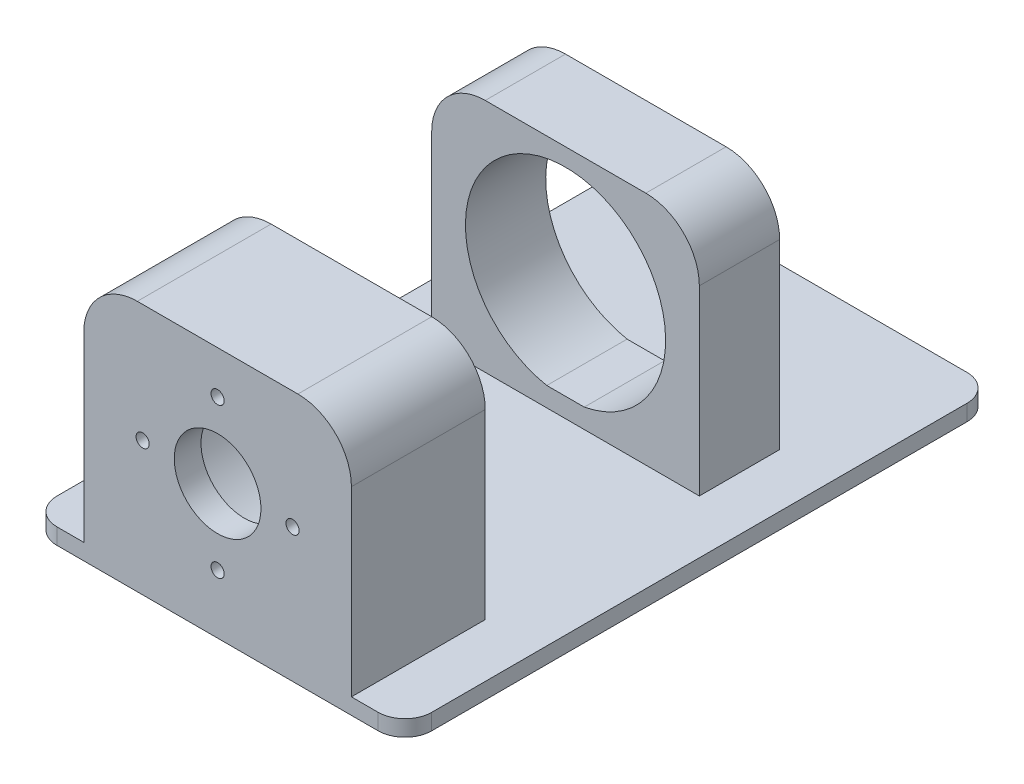
ISO-10303-21;
HEADER;
FILE_DESCRIPTION(('STEP AP214'),'2;1');
FILE_NAME('part.step','',(''),(''),'','','');
FILE_SCHEMA(('AUTOMOTIVE_DESIGN { 1 0 10303 214 1 1 1 1 }'));
ENDSEC;
DATA;
#1=APPLICATION_CONTEXT('core data for automotive mechanical design processes');
#2=APPLICATION_PROTOCOL_DEFINITION('international standard','automotive_design',2000,#1);
#3=PRODUCT_CONTEXT('',#1,'mechanical');
#4=PRODUCT('Part','Part','',(#3));
#5=PRODUCT_RELATED_PRODUCT_CATEGORY('part','',(#4));
#6=PRODUCT_DEFINITION_FORMATION('','',#4);
#7=PRODUCT_DEFINITION_CONTEXT('part definition',#1,'design');
#8=PRODUCT_DEFINITION('design','',#6,#7);
#9=PRODUCT_DEFINITION_SHAPE('','',#8);
#10=(LENGTH_UNIT() NAMED_UNIT(*) SI_UNIT(.MILLI.,.METRE.));
#11=(NAMED_UNIT(*) PLANE_ANGLE_UNIT() SI_UNIT($,.RADIAN.));
#12=(NAMED_UNIT(*) SI_UNIT($,.STERADIAN.) SOLID_ANGLE_UNIT());
#13=UNCERTAINTY_MEASURE_WITH_UNIT(LENGTH_MEASURE(1.E-05),#10,'distance_accuracy_value','');
#14=(GEOMETRIC_REPRESENTATION_CONTEXT(3) GLOBAL_UNCERTAINTY_ASSIGNED_CONTEXT((#13)) GLOBAL_UNIT_ASSIGNED_CONTEXT((#10,
#11,#12)) REPRESENTATION_CONTEXT('',''));
#15=CARTESIAN_POINT('',(0.,0.,0.));
#16=DIRECTION('',(0.,0.,1.));
#17=DIRECTION('',(1.,0.,0.));
#18=AXIS2_PLACEMENT_3D('',#15,#16,#17);
#19=CARTESIAN_POINT('',(0.,-13.0223826502722,0.));
#20=DIRECTION('',(0.,-1.,0.));
#21=DIRECTION('',(0.,0.,-1.));
#22=AXIS2_PLACEMENT_3D('',#19,#20,#21);
#23=PLANE('',#22);
#24=DIRECTION('',(1.,0.,0.));
#25=VECTOR('',#24,1.);
#26=CARTESIAN_POINT('',(23.8257170902648,-13.0223826502722,-59.3149987648499));
#27=LINE('',#26,#25);
#28=CARTESIAN_POINT('',(-41.1742829097352,-13.0223826502722,-59.3149987648499));
#29=VERTEX_POINT('',#28);
#30=CARTESIAN_POINT('',(18.8257170902648,-13.0223826502722,-59.3149987648499));
#31=VERTEX_POINT('',#30);
#32=EDGE_CURVE('E244',#29,#31,#27,.T.);
#33=ORIENTED_EDGE('',*,*,#32,.F.);
#34=CARTESIAN_POINT('',(-41.1742829097352,-13.0223826502722,-54.3149987648499));
#35=DIRECTION('',(0.,-1.,0.));
#36=DIRECTION('',(0.,0.,-1.));
#37=AXIS2_PLACEMENT_3D('',#34,#35,#36);
#38=CIRCLE('',#37,5.);
#39=CARTESIAN_POINT('',(-46.1742829097352,-13.0223826502722,-54.3149987648499));
#40=VERTEX_POINT('',#39);
#41=EDGE_CURVE('E369',#29,#40,#38,.F.);
#42=ORIENTED_EDGE('',*,*,#41,.T.);
#43=DIRECTION('',(0.,0.,-1.));
#44=VECTOR('',#43,1.);
#45=CARTESIAN_POINT('',(-46.1742829097352,-13.0223826502722,-59.3149987648499));
#46=LINE('',#45,#44);
#47=CARTESIAN_POINT('',(-46.1742829097352,-13.0223826502722,45.6850012351502));
#48=VERTEX_POINT('',#47);
#49=EDGE_CURVE('E258',#48,#40,#46,.T.);
#50=ORIENTED_EDGE('',*,*,#49,.F.);
#51=CARTESIAN_POINT('',(-41.1742829097352,-13.0223826502722,45.6850012351502));
#52=DIRECTION('',(0.,-1.,0.));
#53=DIRECTION('',(0.,0.,-1.));
#54=AXIS2_PLACEMENT_3D('',#51,#52,#53);
#55=CIRCLE('',#54,5.);
#56=CARTESIAN_POINT('',(-41.1742829097352,-13.0223826502722,50.6850012351501));
#57=VERTEX_POINT('',#56);
#58=EDGE_CURVE('E363',#48,#57,#55,.F.);
#59=ORIENTED_EDGE('',*,*,#58,.T.);
#60=DIRECTION('',(-1.,0.,0.));
#61=VECTOR('',#60,1.);
#62=CARTESIAN_POINT('',(23.8257170902648,-13.0223826502722,50.6850012351501));
#63=LINE('',#62,#61);
#64=CARTESIAN_POINT('',(-36.1742829097352,-13.0223826502722,50.6850012351501));
#65=VERTEX_POINT('',#64);
#66=EDGE_CURVE('E255',#65,#57,#63,.T.);
#67=ORIENTED_EDGE('',*,*,#66,.F.);
#68=DIRECTION('',(0.,0.,-1.));
#69=VECTOR('',#68,1.);
#70=CARTESIAN_POINT('',(-36.1742829097352,-13.0223826502722,50.6850012351501));
#71=LINE('',#70,#69);
#72=CARTESIAN_POINT('',(-36.1742829097352,-13.0223826502722,25.6850012351502));
#73=VERTEX_POINT('',#72);
#74=EDGE_CURVE('E320',#65,#73,#71,.T.);
#75=ORIENTED_EDGE('',*,*,#74,.T.);
#76=DIRECTION('',(-1.,0.,0.));
#77=VECTOR('',#76,1.);
#78=CARTESIAN_POINT('',(-36.1742829097352,-13.0223826502722,25.6850012351502));
#79=LINE('',#78,#77);
#80=CARTESIAN_POINT('',(13.8257170902648,-13.0223826502722,25.6850012351502));
#81=VERTEX_POINT('',#80);
#82=EDGE_CURVE('E270',#81,#73,#79,.T.);
#83=ORIENTED_EDGE('',*,*,#82,.F.);
#84=DIRECTION('',(0.,0.,-1.));
#85=VECTOR('',#84,1.);
#86=CARTESIAN_POINT('',(13.8257170902648,-13.0223826502722,50.6850012351501));
#87=LINE('',#86,#85);
#88=CARTESIAN_POINT('',(13.8257170902648,-13.0223826502722,50.6850012351501));
#89=VERTEX_POINT('',#88);
#90=EDGE_CURVE('E317',#89,#81,#87,.T.);
#91=ORIENTED_EDGE('',*,*,#90,.F.);
#92=CARTESIAN_POINT('',(18.8257170902648,-13.0223826502722,50.6850012351501));
#93=VERTEX_POINT('',#92);
#94=EDGE_CURVE('E256',#93,#89,#63,.T.);
#95=ORIENTED_EDGE('',*,*,#94,.F.);
#96=CARTESIAN_POINT('',(18.8257170902648,-13.0223826502722,45.6850012351502));
#97=DIRECTION('',(0.,-1.,0.));
#98=DIRECTION('',(0.,0.,-1.));
#99=AXIS2_PLACEMENT_3D('',#96,#97,#98);
#100=CIRCLE('',#99,5.);
#101=CARTESIAN_POINT('',(23.8257170902648,-13.0223826502722,45.6850012351502));
#102=VERTEX_POINT('',#101);
#103=EDGE_CURVE('E365',#93,#102,#100,.F.);
#104=ORIENTED_EDGE('',*,*,#103,.T.);
#105=DIRECTION('',(0.,0.,1.));
#106=VECTOR('',#105,1.);
#107=CARTESIAN_POINT('',(23.8257170902648,-13.0223826502722,-59.3149987648499));
#108=LINE('',#107,#106);
#109=CARTESIAN_POINT('',(23.8257170902648,-13.0223826502722,-54.3149987648499));
#110=VERTEX_POINT('',#109);
#111=EDGE_CURVE('E240',#110,#102,#108,.T.);
#112=ORIENTED_EDGE('',*,*,#111,.F.);
#113=CARTESIAN_POINT('',(18.8257170902648,-13.0223826502722,-54.3149987648499));
#114=DIRECTION('',(0.,-1.,0.));
#115=DIRECTION('',(0.,0.,-1.));
#116=AXIS2_PLACEMENT_3D('',#113,#114,#115);
#117=CIRCLE('',#116,5.);
#118=EDGE_CURVE('E367',#110,#31,#117,.F.);
#119=ORIENTED_EDGE('',*,*,#118,.T.);
#120=EDGE_LOOP('',(#33,#42,#50,#59,#67,#75,#83,#91,#95,#104,#112,#119));
#121=FACE_BOUND('',#120,.T.);
#122=DIRECTION('',(0.,0.,1.));
#123=VECTOR('',#122,1.);
#124=CARTESIAN_POINT('',(13.8257170902648,-13.0223826502722,-29.3149987648499));
#125=LINE('',#124,#123);
#126=CARTESIAN_POINT('',(13.8257170902648,-13.0223826502722,-29.3149987648499));
#127=VERTEX_POINT('',#126);
#128=CARTESIAN_POINT('',(13.8257170902648,-13.0223826502722,-14.3149987648498));
#129=VERTEX_POINT('',#128);
#130=EDGE_CURVE('E237',#127,#129,#125,.T.);
#131=ORIENTED_EDGE('',*,*,#130,.T.);
#132=DIRECTION('',(-1.,0.,0.));
#133=VECTOR('',#132,1.);
#134=CARTESIAN_POINT('',(13.8257170902648,-13.0223826502722,-14.3149987648498));
#135=LINE('',#134,#133);
#136=CARTESIAN_POINT('',(-36.1742829097352,-13.0223826502722,-14.3149987648498));
#137=VERTEX_POINT('',#136);
#138=EDGE_CURVE('E228',#129,#137,#135,.T.);
#139=ORIENTED_EDGE('',*,*,#138,.T.);
#140=DIRECTION('',(0.,0.,1.));
#141=VECTOR('',#140,1.);
#142=CARTESIAN_POINT('',(-36.1742829097352,-13.0223826502722,-29.3149987648499));
#143=LINE('',#142,#141);
#144=CARTESIAN_POINT('',(-36.1742829097352,-13.0223826502722,-29.3149987648499));
#145=VERTEX_POINT('',#144);
#146=EDGE_CURVE('E226',#145,#137,#143,.T.);
#147=ORIENTED_EDGE('',*,*,#146,.F.);
#148=DIRECTION('',(-1.,0.,0.));
#149=VECTOR('',#148,1.);
#150=CARTESIAN_POINT('',(13.8257170902648,-13.0223826502722,-29.3149987648499));
#151=LINE('',#150,#149);
#152=EDGE_CURVE('E216',#127,#145,#151,.T.);
#153=ORIENTED_EDGE('',*,*,#152,.F.);
#154=EDGE_LOOP('',(#131,#139,#147,#153));
#155=FACE_BOUND('',#154,.T.);
#156=ADVANCED_FACE('F39',(#121,#155),#23,.F.);
#157=CARTESIAN_POINT('',(0.,0.,45.6850012351502));
#158=DIRECTION('',(0.,0.,1.));
#159=DIRECTION('',(1.,0.,0.));
#160=AXIS2_PLACEMENT_3D('',#157,#158,#159);
#161=PLANE('',#160);
#162=CARTESIAN_POINT('',(-11.1742829097352,8.9776173497278,45.6850012351502));
#163=DIRECTION('',(0.,0.,1.));
#164=DIRECTION('',(1.,0.,0.));
#165=AXIS2_PLACEMENT_3D('',#162,#163,#164);
#166=CIRCLE('',#165,8.1);
#167=CARTESIAN_POINT('',(-3.07428290973521,8.9776173497278,45.6850012351502));
#168=VERTEX_POINT('',#167);
#169=EDGE_CURVE('E279',#168,#168,#166,.T.);
#170=ORIENTED_EDGE('',*,*,#169,.T.);
#171=EDGE_LOOP('',(#170));
#172=FACE_BOUND('',#171,.T.);
#173=CARTESIAN_POINT('',(-25.1742829097352,8.9776173497278,45.6850012351502));
#174=DIRECTION('',(0.,0.,1.));
#175=DIRECTION('',(1.,0.,0.));
#176=AXIS2_PLACEMENT_3D('',#173,#174,#175);
#177=CIRCLE('',#176,1.2295);
#178=CARTESIAN_POINT('',(-23.9447829097352,8.9776173497278,45.6850012351502));
#179=VERTEX_POINT('',#178);
#180=EDGE_CURVE('E283',#179,#179,#177,.T.);
#181=ORIENTED_EDGE('',*,*,#180,.T.);
#182=EDGE_LOOP('',(#181));
#183=FACE_BOUND('',#182,.T.);
#184=CARTESIAN_POINT('',(-11.1742829097352,-5.0223826502722,45.6850012351502));
#185=DIRECTION('',(0.,0.,1.));
#186=DIRECTION('',(1.,0.,0.));
#187=AXIS2_PLACEMENT_3D('',#184,#185,#186);
#188=CIRCLE('',#187,1.2295);
#189=CARTESIAN_POINT('',(-9.94478290973522,-5.0223826502722,45.6850012351502));
#190=VERTEX_POINT('',#189);
#191=EDGE_CURVE('E289',#190,#190,#188,.T.);
#192=ORIENTED_EDGE('',*,*,#191,.T.);
#193=EDGE_LOOP('',(#192));
#194=FACE_BOUND('',#193,.T.);
#195=CARTESIAN_POINT('',(2.82571709026479,8.9776173497278,45.6850012351502));
#196=DIRECTION('',(0.,0.,1.));
#197=DIRECTION('',(1.,0.,0.));
#198=AXIS2_PLACEMENT_3D('',#195,#196,#197);
#199=CIRCLE('',#198,1.2295);
#200=CARTESIAN_POINT('',(4.05521709026479,8.9776173497278,45.6850012351502));
#201=VERTEX_POINT('',#200);
#202=EDGE_CURVE('E295',#201,#201,#199,.T.);
#203=ORIENTED_EDGE('',*,*,#202,.T.);
#204=EDGE_LOOP('',(#203));
#205=FACE_BOUND('',#204,.T.);
#206=CARTESIAN_POINT('',(-11.1742829097352,22.9776173497278,45.6850012351502));
#207=DIRECTION('',(0.,0.,1.));
#208=DIRECTION('',(1.,0.,0.));
#209=AXIS2_PLACEMENT_3D('',#206,#207,#208);
#210=CIRCLE('',#209,1.2295);
#211=CARTESIAN_POINT('',(-9.94478290973521,22.9776173497278,45.6850012351502));
#212=VERTEX_POINT('',#211);
#213=EDGE_CURVE('E301',#212,#212,#210,.T.);
#214=ORIENTED_EDGE('',*,*,#213,.T.);
#215=EDGE_LOOP('',(#214));
#216=FACE_BOUND('',#215,.T.);
#217=CARTESIAN_POINT('',(-11.1742829097352,8.9776173497278,45.6850012351502));
#218=DIRECTION('',(0.,0.,-1.));
#219=DIRECTION('',(-1.,0.,0.));
#220=AXIS2_PLACEMENT_3D('',#217,#218,#219);
#221=CIRCLE('',#220,18.);
#222=CARTESIAN_POINT('',(-29.1742829097352,8.9776173497278,45.6850012351502));
#223=VERTEX_POINT('',#222);
#224=EDGE_CURVE('E252',#223,#223,#221,.T.);
#225=ORIENTED_EDGE('',*,*,#224,.T.);
#226=EDGE_LOOP('',(#225));
#227=FACE_BOUND('',#226,.T.);
#228=ADVANCED_FACE('F433',(#172,#183,#194,#205,#216,#227),#161,.F.);
#229=CARTESIAN_POINT('',(0.,0.,50.6850012351501));
#230=DIRECTION('',(0.,0.,1.));
#231=DIRECTION('',(1.,0.,0.));
#232=AXIS2_PLACEMENT_3D('',#229,#230,#231);
#233=PLANE('',#232);
#234=CARTESIAN_POINT('',(-25.1742829097352,8.9776173497278,50.6850012351501));
#235=DIRECTION('',(0.,0.,1.));
#236=DIRECTION('',(1.,0.,0.));
#237=AXIS2_PLACEMENT_3D('',#234,#235,#236);
#238=CIRCLE('',#237,1.2295);
#239=CARTESIAN_POINT('',(-23.9447829097352,8.9776173497278,50.6850012351501));
#240=VERTEX_POINT('',#239);
#241=EDGE_CURVE('E286',#240,#240,#238,.T.);
#242=ORIENTED_EDGE('',*,*,#241,.F.);
#243=EDGE_LOOP('',(#242));
#244=FACE_BOUND('',#243,.T.);
#245=CARTESIAN_POINT('',(2.82571709026479,8.9776173497278,50.6850012351501));
#246=DIRECTION('',(0.,0.,1.));
#247=DIRECTION('',(1.,0.,0.));
#248=AXIS2_PLACEMENT_3D('',#245,#246,#247);
#249=CIRCLE('',#248,1.2295);
#250=CARTESIAN_POINT('',(4.05521709026479,8.9776173497278,50.6850012351501));
#251=VERTEX_POINT('',#250);
#252=EDGE_CURVE('E298',#251,#251,#249,.T.);
#253=ORIENTED_EDGE('',*,*,#252,.F.);
#254=EDGE_LOOP('',(#253));
#255=FACE_BOUND('',#254,.T.);
#256=DIRECTION('',(-1.,0.,0.));
#257=VECTOR('',#256,1.);
#258=CARTESIAN_POINT('',(23.8257170902648,-16.0223826502722,50.6850012351501));
#259=LINE('',#258,#257);
#260=CARTESIAN_POINT('',(18.8257170902648,-16.0223826502722,50.6850012351501));
#261=VERTEX_POINT('',#260);
#262=CARTESIAN_POINT('',(-41.1742829097352,-16.0223826502722,50.6850012351501));
#263=VERTEX_POINT('',#262);
#264=EDGE_CURVE('E243',#261,#263,#259,.T.);
#265=ORIENTED_EDGE('',*,*,#264,.F.);
#266=DIRECTION('',(0.,1.,0.));
#267=VECTOR('',#266,1.);
#268=CARTESIAN_POINT('',(18.8257170902648,-13.0223826502722,50.6850012351501));
#269=LINE('',#268,#267);
#270=EDGE_CURVE('E11',#261,#93,#269,.T.);
#271=ORIENTED_EDGE('',*,*,#270,.T.);
#272=ORIENTED_EDGE('',*,*,#94,.T.);
#273=DIRECTION('',(0.,1.,0.));
#274=VECTOR('',#273,1.);
#275=CARTESIAN_POINT('',(13.8257170902648,30.9776173497278,50.6850012351501));
#276=LINE('',#275,#274);
#277=CARTESIAN_POINT('',(13.8257170902648,20.9776173497278,50.6850012351501));
#278=VERTEX_POINT('',#277);
#279=EDGE_CURVE('E307',#89,#278,#276,.T.);
#280=ORIENTED_EDGE('',*,*,#279,.T.);
#281=CARTESIAN_POINT('',(3.82571709026479,20.9776173497278,50.6850012351501));
#282=DIRECTION('',(0.,0.,1.));
#283=DIRECTION('',(1.,0.,0.));
#284=AXIS2_PLACEMENT_3D('',#281,#282,#283);
#285=CIRCLE('',#284,10.);
#286=CARTESIAN_POINT('',(3.82571709026479,30.9776173497278,50.6850012351501));
#287=VERTEX_POINT('',#286);
#288=EDGE_CURVE('E351',#278,#287,#285,.T.);
#289=ORIENTED_EDGE('',*,*,#288,.T.);
#290=DIRECTION('',(-1.,0.,0.));
#291=VECTOR('',#290,1.);
#292=CARTESIAN_POINT('',(-36.1742829097352,30.9776173497278,50.6850012351501));
#293=LINE('',#292,#291);
#294=CARTESIAN_POINT('',(-26.1742829097352,30.9776173497278,50.6850012351501));
#295=VERTEX_POINT('',#294);
#296=EDGE_CURVE('E312',#287,#295,#293,.T.);
#297=ORIENTED_EDGE('',*,*,#296,.T.);
#298=CARTESIAN_POINT('',(-26.1742829097352,20.9776173497278,50.6850012351501));
#299=DIRECTION('',(0.,0.,1.));
#300=DIRECTION('',(1.,0.,0.));
#301=AXIS2_PLACEMENT_3D('',#298,#299,#300);
#302=CIRCLE('',#301,10.);
#303=CARTESIAN_POINT('',(-36.1742829097352,20.9776173497278,50.6850012351501));
#304=VERTEX_POINT('',#303);
#305=EDGE_CURVE('E349',#295,#304,#302,.T.);
#306=ORIENTED_EDGE('',*,*,#305,.T.);
#307=DIRECTION('',(0.,-1.,0.));
#308=VECTOR('',#307,1.);
#309=CARTESIAN_POINT('',(-36.1742829097352,30.9776173497278,50.6850012351501));
#310=LINE('',#309,#308);
#311=EDGE_CURVE('E315',#304,#65,#310,.T.);
#312=ORIENTED_EDGE('',*,*,#311,.T.);
#313=ORIENTED_EDGE('',*,*,#66,.T.);
#314=DIRECTION('',(0.,1.,0.));
#315=VECTOR('',#314,1.);
#316=CARTESIAN_POINT('',(-41.1742829097352,-16.0223826502722,50.6850012351501));
#317=LINE('',#316,#315);
#318=EDGE_CURVE('E47',#57,#263,#317,.F.);
#319=ORIENTED_EDGE('',*,*,#318,.T.);
#320=EDGE_LOOP('',(#265,#271,#272,#280,#289,#297,#306,#312,#313,#319));
#321=FACE_BOUND('',#320,.T.);
#322=CARTESIAN_POINT('',(-11.1742829097352,22.9776173497278,50.6850012351501));
#323=DIRECTION('',(0.,0.,1.));
#324=DIRECTION('',(1.,0.,0.));
#325=AXIS2_PLACEMENT_3D('',#322,#323,#324);
#326=CIRCLE('',#325,1.2295);
#327=CARTESIAN_POINT('',(-9.94478290973521,22.9776173497278,50.6850012351501));
#328=VERTEX_POINT('',#327);
#329=EDGE_CURVE('E304',#328,#328,#326,.T.);
#330=ORIENTED_EDGE('',*,*,#329,.F.);
#331=EDGE_LOOP('',(#330));
#332=FACE_BOUND('',#331,.T.);
#333=CARTESIAN_POINT('',(-11.1742829097352,-5.0223826502722,50.6850012351501));
#334=DIRECTION('',(0.,0.,1.));
#335=DIRECTION('',(1.,0.,0.));
#336=AXIS2_PLACEMENT_3D('',#333,#334,#335);
#337=CIRCLE('',#336,1.2295);
#338=CARTESIAN_POINT('',(-9.94478290973522,-5.0223826502722,50.6850012351501));
#339=VERTEX_POINT('',#338);
#340=EDGE_CURVE('E292',#339,#339,#337,.T.);
#341=ORIENTED_EDGE('',*,*,#340,.F.);
#342=EDGE_LOOP('',(#341));
#343=FACE_BOUND('',#342,.T.);
#344=CARTESIAN_POINT('',(-11.1742829097352,8.9776173497278,50.6850012351501));
#345=DIRECTION('',(0.,0.,1.));
#346=DIRECTION('',(1.,0.,0.));
#347=AXIS2_PLACEMENT_3D('',#344,#345,#346);
#348=CIRCLE('',#347,8.1);
#349=CARTESIAN_POINT('',(-3.07428290973521,8.9776173497278,50.6850012351501));
#350=VERTEX_POINT('',#349);
#351=EDGE_CURVE('E280',#350,#350,#348,.T.);
#352=ORIENTED_EDGE('',*,*,#351,.F.);
#353=EDGE_LOOP('',(#352));
#354=FACE_BOUND('',#353,.T.);
#355=ADVANCED_FACE('F403',(#244,#255,#321,#332,#343,#354),#233,.T.);
#356=CARTESIAN_POINT('',(13.8257170902648,30.9776173497278,50.6850012351501));
#357=DIRECTION('',(-1.,0.,0.));
#358=DIRECTION('',(0.,-1.,0.));
#359=AXIS2_PLACEMENT_3D('',#356,#357,#358);
#360=PLANE('',#359);
#361=DIRECTION('',(0.,-1.,0.));
#362=VECTOR('',#361,1.);
#363=CARTESIAN_POINT('',(13.8257170902648,-13.0223826502722,25.6850012351502));
#364=LINE('',#363,#362);
#365=CARTESIAN_POINT('',(13.8257170902648,20.9776173497278,25.6850012351502));
#366=VERTEX_POINT('',#365);
#367=EDGE_CURVE('E266',#366,#81,#364,.T.);
#368=ORIENTED_EDGE('',*,*,#367,.F.);
#369=DIRECTION('',(0.,0.,-1.));
#370=VECTOR('',#369,1.);
#371=CARTESIAN_POINT('',(13.8257170902648,20.9776173497278,50.6850012351501));
#372=LINE('',#371,#370);
#373=EDGE_CURVE('E347',#366,#278,#372,.F.);
#374=ORIENTED_EDGE('',*,*,#373,.T.);
#375=ORIENTED_EDGE('',*,*,#279,.F.);
#376=ORIENTED_EDGE('',*,*,#90,.T.);
#377=EDGE_LOOP('',(#368,#374,#375,#376));
#378=FACE_BOUND('',#377,.T.);
#379=ADVANCED_FACE('F479',(#378),#360,.F.);
#380=CARTESIAN_POINT('',(-36.1742829097352,30.9776173497278,50.6850012351501));
#381=DIRECTION('',(0.,-1.,0.));
#382=DIRECTION('',(0.,0.,-1.));
#383=AXIS2_PLACEMENT_3D('',#380,#381,#382);
#384=PLANE('',#383);
#385=ORIENTED_EDGE('',*,*,#296,.F.);
#386=DIRECTION('',(0.,0.,-1.));
#387=VECTOR('',#386,1.);
#388=CARTESIAN_POINT('',(3.82571709026479,30.9776173497278,50.6850012351501));
#389=LINE('',#388,#387);
#390=CARTESIAN_POINT('',(3.82571709026479,30.9776173497278,25.6850012351502));
#391=VERTEX_POINT('',#390);
#392=EDGE_CURVE('E340',#287,#391,#389,.T.);
#393=ORIENTED_EDGE('',*,*,#392,.T.);
#394=DIRECTION('',(1.,0.,0.));
#395=VECTOR('',#394,1.);
#396=CARTESIAN_POINT('',(13.8257170902648,30.9776173497278,25.6850012351502));
#397=LINE('',#396,#395);
#398=CARTESIAN_POINT('',(-26.1742829097352,30.9776173497278,25.6850012351502));
#399=VERTEX_POINT('',#398);
#400=EDGE_CURVE('E276',#399,#391,#397,.T.);
#401=ORIENTED_EDGE('',*,*,#400,.F.);
#402=DIRECTION('',(0.,0.,-1.));
#403=VECTOR('',#402,1.);
#404=CARTESIAN_POINT('',(-26.1742829097352,30.9776173497278,50.6850012351501));
#405=LINE('',#404,#403);
#406=EDGE_CURVE('E338',#399,#295,#405,.F.);
#407=ORIENTED_EDGE('',*,*,#406,.T.);
#408=EDGE_LOOP('',(#385,#393,#401,#407));
#409=FACE_BOUND('',#408,.T.);
#410=ADVANCED_FACE('F484',(#409),#384,.F.);
#411=CARTESIAN_POINT('',(-36.1742829097352,30.9776173497278,50.6850012351501));
#412=DIRECTION('',(1.,0.,0.));
#413=DIRECTION('',(0.,0.,-1.));
#414=AXIS2_PLACEMENT_3D('',#411,#412,#413);
#415=PLANE('',#414);
#416=ORIENTED_EDGE('',*,*,#311,.F.);
#417=DIRECTION('',(0.,0.,-1.));
#418=VECTOR('',#417,1.);
#419=CARTESIAN_POINT('',(-36.1742829097352,20.9776173497278,50.6850012351501));
#420=LINE('',#419,#418);
#421=CARTESIAN_POINT('',(-36.1742829097352,20.9776173497278,25.6850012351502));
#422=VERTEX_POINT('',#421);
#423=EDGE_CURVE('E353',#304,#422,#420,.T.);
#424=ORIENTED_EDGE('',*,*,#423,.T.);
#425=DIRECTION('',(0.,1.,0.));
#426=VECTOR('',#425,1.);
#427=CARTESIAN_POINT('',(-36.1742829097352,30.9776173497278,25.6850012351502));
#428=LINE('',#427,#426);
#429=EDGE_CURVE('E273',#73,#422,#428,.T.);
#430=ORIENTED_EDGE('',*,*,#429,.F.);
#431=ORIENTED_EDGE('',*,*,#74,.F.);
#432=EDGE_LOOP('',(#416,#424,#430,#431));
#433=FACE_BOUND('',#432,.T.);
#434=ADVANCED_FACE('F476',(#433),#415,.F.);
#435=CARTESIAN_POINT('',(-11.1742829097352,22.9776173497278,50.6850012351501));
#436=DIRECTION('',(0.,0.,-1.));
#437=DIRECTION('',(-1.,0.,0.));
#438=AXIS2_PLACEMENT_3D('',#435,#436,#437);
#439=CYLINDRICAL_SURFACE('',#438,1.2295);
#440=ORIENTED_EDGE('',*,*,#329,.T.);
#441=EDGE_LOOP('',(#440));
#442=FACE_BOUND('',#441,.T.);
#443=ORIENTED_EDGE('',*,*,#213,.F.);
#444=EDGE_LOOP('',(#443));
#445=FACE_BOUND('',#444,.T.);
#446=ADVANCED_FACE('F472',(#442,#445),#439,.F.);
#447=CARTESIAN_POINT('',(2.82571709026479,8.9776173497278,50.6850012351501));
#448=DIRECTION('',(0.,0.,-1.));
#449=DIRECTION('',(-1.,0.,0.));
#450=AXIS2_PLACEMENT_3D('',#447,#448,#449);
#451=CYLINDRICAL_SURFACE('',#450,1.2295);
#452=ORIENTED_EDGE('',*,*,#252,.T.);
#453=EDGE_LOOP('',(#452));
#454=FACE_BOUND('',#453,.T.);
#455=ORIENTED_EDGE('',*,*,#202,.F.);
#456=EDGE_LOOP('',(#455));
#457=FACE_BOUND('',#456,.T.);
#458=ADVANCED_FACE('F468',(#454,#457),#451,.F.);
#459=CARTESIAN_POINT('',(-11.1742829097352,-5.0223826502722,50.6850012351501));
#460=DIRECTION('',(0.,0.,-1.));
#461=DIRECTION('',(-1.,0.,0.));
#462=AXIS2_PLACEMENT_3D('',#459,#460,#461);
#463=CYLINDRICAL_SURFACE('',#462,1.2295);
#464=ORIENTED_EDGE('',*,*,#340,.T.);
#465=EDGE_LOOP('',(#464));
#466=FACE_BOUND('',#465,.T.);
#467=ORIENTED_EDGE('',*,*,#191,.F.);
#468=EDGE_LOOP('',(#467));
#469=FACE_BOUND('',#468,.T.);
#470=ADVANCED_FACE('F464',(#466,#469),#463,.F.);
#471=CARTESIAN_POINT('',(-25.1742829097352,8.9776173497278,50.6850012351501));
#472=DIRECTION('',(0.,0.,-1.));
#473=DIRECTION('',(-1.,0.,0.));
#474=AXIS2_PLACEMENT_3D('',#471,#472,#473);
#475=CYLINDRICAL_SURFACE('',#474,1.2295);
#476=ORIENTED_EDGE('',*,*,#241,.T.);
#477=EDGE_LOOP('',(#476));
#478=FACE_BOUND('',#477,.T.);
#479=ORIENTED_EDGE('',*,*,#180,.F.);
#480=EDGE_LOOP('',(#479));
#481=FACE_BOUND('',#480,.T.);
#482=ADVANCED_FACE('F460',(#478,#481),#475,.F.);
#483=CARTESIAN_POINT('',(-11.1742829097352,8.9776173497278,50.6850012351501));
#484=DIRECTION('',(0.,0.,-1.));
#485=DIRECTION('',(-1.,0.,0.));
#486=AXIS2_PLACEMENT_3D('',#483,#484,#485);
#487=CYLINDRICAL_SURFACE('',#486,8.1);
#488=ORIENTED_EDGE('',*,*,#351,.T.);
#489=EDGE_LOOP('',(#488));
#490=FACE_BOUND('',#489,.T.);
#491=ORIENTED_EDGE('',*,*,#169,.F.);
#492=EDGE_LOOP('',(#491));
#493=FACE_BOUND('',#492,.T.);
#494=ADVANCED_FACE('F456',(#490,#493),#487,.F.);
#495=CARTESIAN_POINT('',(0.,0.,25.6850012351502));
#496=DIRECTION('',(0.,0.,1.));
#497=DIRECTION('',(1.,0.,0.));
#498=AXIS2_PLACEMENT_3D('',#495,#496,#497);
#499=PLANE('',#498);
#500=ORIENTED_EDGE('',*,*,#400,.T.);
#501=CARTESIAN_POINT('',(3.82571709026479,20.9776173497278,25.6850012351502));
#502=DIRECTION('',(0.,0.,1.));
#503=DIRECTION('',(1.,0.,0.));
#504=AXIS2_PLACEMENT_3D('',#501,#502,#503);
#505=CIRCLE('',#504,10.);
#506=EDGE_CURVE('E345',#391,#366,#505,.F.);
#507=ORIENTED_EDGE('',*,*,#506,.T.);
#508=ORIENTED_EDGE('',*,*,#367,.T.);
#509=ORIENTED_EDGE('',*,*,#82,.T.);
#510=ORIENTED_EDGE('',*,*,#429,.T.);
#511=CARTESIAN_POINT('',(-26.1742829097352,20.9776173497278,25.6850012351502));
#512=DIRECTION('',(0.,0.,1.));
#513=DIRECTION('',(1.,0.,0.));
#514=AXIS2_PLACEMENT_3D('',#511,#512,#513);
#515=CIRCLE('',#514,10.);
#516=EDGE_CURVE('E343',#422,#399,#515,.F.);
#517=ORIENTED_EDGE('',*,*,#516,.T.);
#518=EDGE_LOOP('',(#500,#507,#508,#509,#510,#517));
#519=FACE_BOUND('',#518,.T.);
#520=CARTESIAN_POINT('',(-11.1742829097352,8.9776173497278,25.6850012351502));
#521=DIRECTION('',(0.,0.,-1.));
#522=DIRECTION('',(-1.,0.,0.));
#523=AXIS2_PLACEMENT_3D('',#520,#521,#522);
#524=CIRCLE('',#523,18.);
#525=CARTESIAN_POINT('',(-29.1742829097352,8.9776173497278,25.6850012351502));
#526=VERTEX_POINT('',#525);
#527=EDGE_CURVE('E263',#526,#526,#524,.T.);
#528=ORIENTED_EDGE('',*,*,#527,.F.);
#529=EDGE_LOOP('',(#528));
#530=FACE_BOUND('',#529,.T.);
#531=ADVANCED_FACE('F452',(#519,#530),#499,.F.);
#532=CARTESIAN_POINT('',(-11.1742829097352,8.9776173497278,25.6850012351502));
#533=DIRECTION('',(0.,0.,1.));
#534=DIRECTION('',(1.,0.,0.));
#535=AXIS2_PLACEMENT_3D('',#532,#533,#534);
#536=CYLINDRICAL_SURFACE('',#535,18.);
#537=ORIENTED_EDGE('',*,*,#527,.T.);
#538=EDGE_LOOP('',(#537));
#539=FACE_BOUND('',#538,.T.);
#540=ORIENTED_EDGE('',*,*,#224,.F.);
#541=EDGE_LOOP('',(#540));
#542=FACE_BOUND('',#541,.T.);
#543=ADVANCED_FACE('F449',(#539,#542),#536,.F.);
#544=CARTESIAN_POINT('',(23.8257170902648,-16.0223826502722,-59.3149987648499));
#545=DIRECTION('',(-1.,0.,0.));
#546=DIRECTION('',(0.,0.,1.));
#547=AXIS2_PLACEMENT_3D('',#544,#545,#546);
#548=PLANE('',#547);
#549=DIRECTION('',(0.,0.,1.));
#550=VECTOR('',#549,1.);
#551=CARTESIAN_POINT('',(23.8257170902648,-16.0223826502722,-59.3149987648499));
#552=LINE('',#551,#550);
#553=CARTESIAN_POINT('',(23.8257170902648,-16.0223826502722,-54.3149987648499));
#554=VERTEX_POINT('',#553);
#555=CARTESIAN_POINT('',(23.8257170902648,-16.0223826502722,45.6850012351502));
#556=VERTEX_POINT('',#555);
#557=EDGE_CURVE('E241',#554,#556,#552,.T.);
#558=ORIENTED_EDGE('',*,*,#557,.F.);
#559=DIRECTION('',(0.,1.,0.));
#560=VECTOR('',#559,1.);
#561=CARTESIAN_POINT('',(23.8257170902648,-16.0223826502722,-54.3149987648499));
#562=LINE('',#561,#560);
#563=EDGE_CURVE('E385',#554,#110,#562,.T.);
#564=ORIENTED_EDGE('',*,*,#563,.T.);
#565=ORIENTED_EDGE('',*,*,#111,.T.);
#566=DIRECTION('',(0.,1.,0.));
#567=VECTOR('',#566,1.);
#568=CARTESIAN_POINT('',(23.8257170902648,-16.0223826502722,45.6850012351502));
#569=LINE('',#568,#567);
#570=EDGE_CURVE('E383',#102,#556,#569,.F.);
#571=ORIENTED_EDGE('',*,*,#570,.T.);
#572=EDGE_LOOP('',(#558,#564,#565,#571));
#573=FACE_BOUND('',#572,.T.);
#574=ADVANCED_FACE('F391',(#573),#548,.F.);
#575=CARTESIAN_POINT('',(-46.1742829097352,-16.0223826502722,-59.3149987648499));
#576=DIRECTION('',(1.,0.,0.));
#577=DIRECTION('',(0.,0.,-1.));
#578=AXIS2_PLACEMENT_3D('',#575,#576,#577);
#579=PLANE('',#578);
#580=ORIENTED_EDGE('',*,*,#49,.T.);
#581=DIRECTION('',(0.,1.,0.));
#582=VECTOR('',#581,1.);
#583=CARTESIAN_POINT('',(-46.1742829097352,-16.0223826502722,-54.3149987648499));
#584=LINE('',#583,#582);
#585=CARTESIAN_POINT('',(-46.1742829097352,-16.0223826502722,-54.3149987648499));
#586=VERTEX_POINT('',#585);
#587=EDGE_CURVE('E374',#40,#586,#584,.F.);
#588=ORIENTED_EDGE('',*,*,#587,.T.);
#589=DIRECTION('',(0.,0.,-1.));
#590=VECTOR('',#589,1.);
#591=CARTESIAN_POINT('',(-46.1742829097352,-16.0223826502722,-59.3149987648499));
#592=LINE('',#591,#590);
#593=CARTESIAN_POINT('',(-46.1742829097352,-16.0223826502722,45.6850012351502));
#594=VERTEX_POINT('',#593);
#595=EDGE_CURVE('E246',#594,#586,#592,.T.);
#596=ORIENTED_EDGE('',*,*,#595,.F.);
#597=DIRECTION('',(0.,1.,0.));
#598=VECTOR('',#597,1.);
#599=CARTESIAN_POINT('',(-46.1742829097352,-13.0223826502722,45.6850012351502));
#600=LINE('',#599,#598);
#601=EDGE_CURVE('E371',#594,#48,#600,.T.);
#602=ORIENTED_EDGE('',*,*,#601,.T.);
#603=EDGE_LOOP('',(#580,#588,#596,#602));
#604=FACE_BOUND('',#603,.T.);
#605=ADVANCED_FACE('F412',(#604),#579,.F.);
#606=CARTESIAN_POINT('',(23.8257170902648,-16.0223826502722,-59.3149987648499));
#607=DIRECTION('',(0.,0.,1.));
#608=DIRECTION('',(1.,0.,0.));
#609=AXIS2_PLACEMENT_3D('',#606,#607,#608);
#610=PLANE('',#609);
#611=DIRECTION('',(1.,0.,0.));
#612=VECTOR('',#611,1.);
#613=CARTESIAN_POINT('',(23.8257170902648,-16.0223826502722,-59.3149987648499));
#614=LINE('',#613,#612);
#615=CARTESIAN_POINT('',(-41.1742829097352,-16.0223826502722,-59.3149987648499));
#616=VERTEX_POINT('',#615);
#617=CARTESIAN_POINT('',(18.8257170902648,-16.0223826502722,-59.3149987648499));
#618=VERTEX_POINT('',#617);
#619=EDGE_CURVE('E249',#616,#618,#614,.T.);
#620=ORIENTED_EDGE('',*,*,#619,.F.);
#621=DIRECTION('',(0.,1.,0.));
#622=VECTOR('',#621,1.);
#623=CARTESIAN_POINT('',(-41.1742829097352,-16.0223826502722,-59.3149987648499));
#624=LINE('',#623,#622);
#625=EDGE_CURVE('E360',#616,#29,#624,.T.);
#626=ORIENTED_EDGE('',*,*,#625,.T.);
#627=ORIENTED_EDGE('',*,*,#32,.T.);
#628=DIRECTION('',(0.,1.,0.));
#629=VECTOR('',#628,1.);
#630=CARTESIAN_POINT('',(18.8257170902648,-16.0223826502722,-59.3149987648499));
#631=LINE('',#630,#629);
#632=EDGE_CURVE('E358',#31,#618,#631,.F.);
#633=ORIENTED_EDGE('',*,*,#632,.T.);
#634=EDGE_LOOP('',(#620,#626,#627,#633));
#635=FACE_BOUND('',#634,.T.);
#636=ADVANCED_FACE('F421',(#635),#610,.F.);
#637=CARTESIAN_POINT('',(0.,-16.0223826502722,0.));
#638=DIRECTION('',(0.,-1.,0.));
#639=DIRECTION('',(0.,0.,-1.));
#640=AXIS2_PLACEMENT_3D('',#637,#638,#639);
#641=PLANE('',#640);
#642=ORIENTED_EDGE('',*,*,#595,.T.);
#643=CARTESIAN_POINT('',(-41.1742829097352,-16.0223826502722,-54.3149987648499));
#644=DIRECTION('',(0.,-1.,0.));
#645=DIRECTION('',(0.,0.,-1.));
#646=AXIS2_PLACEMENT_3D('',#643,#644,#645);
#647=CIRCLE('',#646,5.);
#648=EDGE_CURVE('E381',#586,#616,#647,.T.);
#649=ORIENTED_EDGE('',*,*,#648,.T.);
#650=ORIENTED_EDGE('',*,*,#619,.T.);
#651=CARTESIAN_POINT('',(18.8257170902648,-16.0223826502722,-54.3149987648499));
#652=DIRECTION('',(0.,-1.,0.));
#653=DIRECTION('',(0.,0.,-1.));
#654=AXIS2_PLACEMENT_3D('',#651,#652,#653);
#655=CIRCLE('',#654,5.);
#656=EDGE_CURVE('E379',#618,#554,#655,.T.);
#657=ORIENTED_EDGE('',*,*,#656,.T.);
#658=ORIENTED_EDGE('',*,*,#557,.T.);
#659=CARTESIAN_POINT('',(18.8257170902648,-16.0223826502722,45.6850012351502));
#660=DIRECTION('',(0.,-1.,0.));
#661=DIRECTION('',(0.,0.,-1.));
#662=AXIS2_PLACEMENT_3D('',#659,#660,#661);
#663=CIRCLE('',#662,5.);
#664=EDGE_CURVE('E60',#556,#261,#663,.T.);
#665=ORIENTED_EDGE('',*,*,#664,.T.);
#666=ORIENTED_EDGE('',*,*,#264,.T.);
#667=CARTESIAN_POINT('',(-41.1742829097352,-16.0223826502722,45.6850012351502));
#668=DIRECTION('',(0.,-1.,0.));
#669=DIRECTION('',(0.,0.,-1.));
#670=AXIS2_PLACEMENT_3D('',#667,#668,#669);
#671=CIRCLE('',#670,5.);
#672=EDGE_CURVE('E376',#263,#594,#671,.T.);
#673=ORIENTED_EDGE('',*,*,#672,.T.);
#674=EDGE_LOOP('',(#642,#649,#650,#657,#658,#665,#666,#673));
#675=FACE_BOUND('',#674,.T.);
#676=ADVANCED_FACE('F406',(#675),#641,.T.);
#677=CARTESIAN_POINT('',(0.,0.,-29.3149987648499));
#678=DIRECTION('',(0.,0.,-1.));
#679=DIRECTION('',(-1.,0.,0.));
#680=AXIS2_PLACEMENT_3D('',#677,#678,#679);
#681=PLANE('',#680);
#682=DIRECTION('',(1.,0.,0.));
#683=VECTOR('',#682,1.);
#684=CARTESIAN_POINT('',(-36.1742829097352,30.9776173497278,-29.3149987648499));
#685=LINE('',#684,#683);
#686=CARTESIAN_POINT('',(-26.1742829097352,30.9776173497278,-29.3149987648499));
#687=VERTEX_POINT('',#686);
#688=CARTESIAN_POINT('',(3.8257170902648,30.9776173497278,-29.3149987648499));
#689=VERTEX_POINT('',#688);
#690=EDGE_CURVE('E223',#687,#689,#685,.T.);
#691=ORIENTED_EDGE('',*,*,#690,.T.);
#692=CARTESIAN_POINT('',(3.8257170902648,20.9776173497278,-29.3149987648499));
#693=DIRECTION('',(0.,0.,-1.));
#694=DIRECTION('',(-1.,0.,0.));
#695=AXIS2_PLACEMENT_3D('',#692,#693,#694);
#696=CIRCLE('',#695,10.);
#697=CARTESIAN_POINT('',(13.8257170902648,20.9776173497278,-29.3149987648499));
#698=VERTEX_POINT('',#697);
#699=EDGE_CURVE('E336',#689,#698,#696,.T.);
#700=ORIENTED_EDGE('',*,*,#699,.T.);
#701=DIRECTION('',(0.,-1.,0.));
#702=VECTOR('',#701,1.);
#703=CARTESIAN_POINT('',(13.8257170902648,30.9776173497278,-29.3149987648499));
#704=LINE('',#703,#702);
#705=EDGE_CURVE('E214',#698,#127,#704,.T.);
#706=ORIENTED_EDGE('',*,*,#705,.T.);
#707=ORIENTED_EDGE('',*,*,#152,.T.);
#708=DIRECTION('',(0.,1.,0.));
#709=VECTOR('',#708,1.);
#710=CARTESIAN_POINT('',(-36.1742829097352,-13.0223826502722,-29.3149987648499));
#711=LINE('',#710,#709);
#712=CARTESIAN_POINT('',(-36.1742829097352,20.9776173497278,-29.3149987648499));
#713=VERTEX_POINT('',#712);
#714=EDGE_CURVE('E220',#145,#713,#711,.T.);
#715=ORIENTED_EDGE('',*,*,#714,.T.);
#716=CARTESIAN_POINT('',(-26.1742829097352,20.9776173497278,-29.3149987648499));
#717=DIRECTION('',(0.,0.,-1.));
#718=DIRECTION('',(-1.,0.,0.));
#719=AXIS2_PLACEMENT_3D('',#716,#717,#718);
#720=CIRCLE('',#719,10.);
#721=EDGE_CURVE('E334',#713,#687,#720,.T.);
#722=ORIENTED_EDGE('',*,*,#721,.T.);
#723=EDGE_LOOP('',(#691,#700,#706,#707,#715,#722));
#724=FACE_BOUND('',#723,.T.);
#725=DIRECTION('',(-1.,0.,0.));
#726=VECTOR('',#725,1.);
#727=CARTESIAN_POINT('',(-7.67428290973521,-9.3919226554003,-29.3149987648499));
#728=LINE('',#727,#726);
#729=CARTESIAN_POINT('',(-7.67428290973521,-9.3919226554003,-29.3149987648499));
#730=VERTEX_POINT('',#729);
#731=CARTESIAN_POINT('',(-14.6742829097352,-9.3919226554003,-29.3149987648499));
#732=VERTEX_POINT('',#731);
#733=EDGE_CURVE('E189',#730,#732,#728,.T.);
#734=ORIENTED_EDGE('',*,*,#733,.F.);
#735=CARTESIAN_POINT('',(-11.1742829097352,8.9776173497278,-29.3149987648499));
#736=DIRECTION('',(0.,0.,-1.));
#737=DIRECTION('',(-1.,0.,0.));
#738=AXIS2_PLACEMENT_3D('',#735,#736,#737);
#739=CIRCLE('',#738,18.7);
#740=EDGE_CURVE('E199',#732,#730,#739,.T.);
#741=ORIENTED_EDGE('',*,*,#740,.F.);
#742=EDGE_LOOP('',(#734,#741));
#743=FACE_BOUND('',#742,.T.);
#744=ADVANCED_FACE('F206',(#724,#743),#681,.T.);
#745=CARTESIAN_POINT('',(0.,0.,-14.3149987648498));
#746=DIRECTION('',(0.,0.,-1.));
#747=DIRECTION('',(-1.,0.,0.));
#748=AXIS2_PLACEMENT_3D('',#745,#746,#747);
#749=PLANE('',#748);
#750=DIRECTION('',(0.,-1.,0.));
#751=VECTOR('',#750,1.);
#752=CARTESIAN_POINT('',(13.8257170902648,30.9776173497278,-14.3149987648498));
#753=LINE('',#752,#751);
#754=CARTESIAN_POINT('',(13.8257170902648,20.9776173497278,-14.3149987648498));
#755=VERTEX_POINT('',#754);
#756=EDGE_CURVE('E213',#755,#129,#753,.T.);
#757=ORIENTED_EDGE('',*,*,#756,.F.);
#758=CARTESIAN_POINT('',(3.8257170902648,20.9776173497278,-14.3149987648498));
#759=DIRECTION('',(0.,0.,-1.));
#760=DIRECTION('',(-1.,0.,0.));
#761=AXIS2_PLACEMENT_3D('',#758,#759,#760);
#762=CIRCLE('',#761,10.);
#763=CARTESIAN_POINT('',(3.8257170902648,30.9776173497278,-14.3149987648498));
#764=VERTEX_POINT('',#763);
#765=EDGE_CURVE('E327',#755,#764,#762,.F.);
#766=ORIENTED_EDGE('',*,*,#765,.T.);
#767=DIRECTION('',(1.,0.,0.));
#768=VECTOR('',#767,1.);
#769=CARTESIAN_POINT('',(-36.1742829097352,30.9776173497278,-14.3149987648498));
#770=LINE('',#769,#768);
#771=CARTESIAN_POINT('',(-26.1742829097352,30.9776173497278,-14.3149987648498));
#772=VERTEX_POINT('',#771);
#773=EDGE_CURVE('E217',#772,#764,#770,.T.);
#774=ORIENTED_EDGE('',*,*,#773,.F.);
#775=CARTESIAN_POINT('',(-26.1742829097352,20.9776173497278,-14.3149987648498));
#776=DIRECTION('',(0.,0.,-1.));
#777=DIRECTION('',(-1.,0.,0.));
#778=AXIS2_PLACEMENT_3D('',#775,#776,#777);
#779=CIRCLE('',#778,10.);
#780=CARTESIAN_POINT('',(-36.1742829097352,20.9776173497278,-14.3149987648498));
#781=VERTEX_POINT('',#780);
#782=EDGE_CURVE('E325',#772,#781,#779,.F.);
#783=ORIENTED_EDGE('',*,*,#782,.T.);
#784=DIRECTION('',(0.,1.,0.));
#785=VECTOR('',#784,1.);
#786=CARTESIAN_POINT('',(-36.1742829097352,-13.0223826502722,-14.3149987648498));
#787=LINE('',#786,#785);
#788=EDGE_CURVE('E230',#137,#781,#787,.T.);
#789=ORIENTED_EDGE('',*,*,#788,.F.);
#790=ORIENTED_EDGE('',*,*,#138,.F.);
#791=EDGE_LOOP('',(#757,#766,#774,#783,#789,#790));
#792=FACE_BOUND('',#791,.T.);
#793=CARTESIAN_POINT('',(-11.1742829097352,8.9776173497278,-14.3149987648498));
#794=DIRECTION('',(0.,0.,-1.));
#795=DIRECTION('',(-1.,0.,0.));
#796=AXIS2_PLACEMENT_3D('',#793,#794,#795);
#797=CIRCLE('',#796,18.7);
#798=CARTESIAN_POINT('',(-14.6742829097352,-9.3919226554003,-14.3149987648498));
#799=VERTEX_POINT('',#798);
#800=CARTESIAN_POINT('',(-7.67428290973521,-9.3919226554003,-14.3149987648498));
#801=VERTEX_POINT('',#800);
#802=EDGE_CURVE('E204',#799,#801,#797,.T.);
#803=ORIENTED_EDGE('',*,*,#802,.T.);
#804=DIRECTION('',(-1.,0.,0.));
#805=VECTOR('',#804,1.);
#806=CARTESIAN_POINT('',(-7.67428290973521,-9.3919226554003,-14.3149987648498));
#807=LINE('',#806,#805);
#808=EDGE_CURVE('E207',#801,#799,#807,.T.);
#809=ORIENTED_EDGE('',*,*,#808,.T.);
#810=EDGE_LOOP('',(#803,#809));
#811=FACE_BOUND('',#810,.T.);
#812=ADVANCED_FACE('F529',(#792,#811),#749,.F.);
#813=CARTESIAN_POINT('',(13.8257170902648,30.9776173497278,-29.3149987648499));
#814=DIRECTION('',(-1.,0.,0.));
#815=DIRECTION('',(0.,0.,1.));
#816=AXIS2_PLACEMENT_3D('',#813,#814,#815);
#817=PLANE('',#816);
#818=ORIENTED_EDGE('',*,*,#705,.F.);
#819=DIRECTION('',(0.,0.,1.));
#820=VECTOR('',#819,1.);
#821=CARTESIAN_POINT('',(13.8257170902648,20.9776173497278,-29.3149987648499));
#822=LINE('',#821,#820);
#823=EDGE_CURVE('E322',#698,#755,#822,.T.);
#824=ORIENTED_EDGE('',*,*,#823,.T.);
#825=ORIENTED_EDGE('',*,*,#756,.T.);
#826=ORIENTED_EDGE('',*,*,#130,.F.);
#827=EDGE_LOOP('',(#818,#824,#825,#826));
#828=FACE_BOUND('',#827,.T.);
#829=ADVANCED_FACE('F524',(#828),#817,.F.);
#830=CARTESIAN_POINT('',(-36.1742829097352,-13.0223826502722,-29.3149987648499));
#831=DIRECTION('',(1.,0.,0.));
#832=DIRECTION('',(0.,0.,-1.));
#833=AXIS2_PLACEMENT_3D('',#830,#831,#832);
#834=PLANE('',#833);
#835=ORIENTED_EDGE('',*,*,#788,.T.);
#836=DIRECTION('',(0.,0.,1.));
#837=VECTOR('',#836,1.);
#838=CARTESIAN_POINT('',(-36.1742829097352,20.9776173497278,-29.3149987648499));
#839=LINE('',#838,#837);
#840=EDGE_CURVE('E356',#781,#713,#839,.F.);
#841=ORIENTED_EDGE('',*,*,#840,.T.);
#842=ORIENTED_EDGE('',*,*,#714,.F.);
#843=ORIENTED_EDGE('',*,*,#146,.T.);
#844=EDGE_LOOP('',(#835,#841,#842,#843));
#845=FACE_BOUND('',#844,.T.);
#846=ADVANCED_FACE('F532',(#845),#834,.F.);
#847=CARTESIAN_POINT('',(-36.1742829097352,30.9776173497278,-29.3149987648499));
#848=DIRECTION('',(0.,-1.,0.));
#849=DIRECTION('',(0.,0.,-1.));
#850=AXIS2_PLACEMENT_3D('',#847,#848,#849);
#851=PLANE('',#850);
#852=ORIENTED_EDGE('',*,*,#773,.T.);
#853=DIRECTION('',(0.,0.,1.));
#854=VECTOR('',#853,1.);
#855=CARTESIAN_POINT('',(3.8257170902648,30.9776173497278,-29.3149987648499));
#856=LINE('',#855,#854);
#857=EDGE_CURVE('E332',#764,#689,#856,.F.);
#858=ORIENTED_EDGE('',*,*,#857,.T.);
#859=ORIENTED_EDGE('',*,*,#690,.F.);
#860=DIRECTION('',(0.,0.,1.));
#861=VECTOR('',#860,1.);
#862=CARTESIAN_POINT('',(-26.1742829097352,30.9776173497278,-29.3149987648499));
#863=LINE('',#862,#861);
#864=EDGE_CURVE('E329',#687,#772,#863,.T.);
#865=ORIENTED_EDGE('',*,*,#864,.T.);
#866=EDGE_LOOP('',(#852,#858,#859,#865));
#867=FACE_BOUND('',#866,.T.);
#868=ADVANCED_FACE('F516',(#867),#851,.F.);
#869=CARTESIAN_POINT('',(-11.1742829097352,8.9776173497278,-29.3149987648499));
#870=DIRECTION('',(0.,0.,1.));
#871=DIRECTION('',(1.,0.,0.));
#872=AXIS2_PLACEMENT_3D('',#869,#870,#871);
#873=CYLINDRICAL_SURFACE('',#872,18.7);
#874=ORIENTED_EDGE('',*,*,#802,.F.);
#875=DIRECTION('',(0.,0.,1.));
#876=VECTOR('',#875,1.);
#877=CARTESIAN_POINT('',(-14.6742829097352,-9.3919226554003,-29.3149987648499));
#878=LINE('',#877,#876);
#879=EDGE_CURVE('E192',#732,#799,#878,.T.);
#880=ORIENTED_EDGE('',*,*,#879,.F.);
#881=ORIENTED_EDGE('',*,*,#740,.T.);
#882=DIRECTION('',(0.,0.,1.));
#883=VECTOR('',#882,1.);
#884=CARTESIAN_POINT('',(-7.67428290973521,-9.3919226554003,-29.3149987648499));
#885=LINE('',#884,#883);
#886=EDGE_CURVE('E195',#730,#801,#885,.T.);
#887=ORIENTED_EDGE('',*,*,#886,.T.);
#888=EDGE_LOOP('',(#874,#880,#881,#887));
#889=FACE_BOUND('',#888,.T.);
#890=ADVANCED_FACE('F202',(#889),#873,.F.);
#891=CARTESIAN_POINT('',(-7.67428290973521,-9.3919226554003,-29.3149987648499));
#892=DIRECTION('',(0.,1.,0.));
#893=DIRECTION('',(0.,0.,1.));
#894=AXIS2_PLACEMENT_3D('',#891,#892,#893);
#895=PLANE('',#894);
#896=ORIENTED_EDGE('',*,*,#808,.F.);
#897=ORIENTED_EDGE('',*,*,#886,.F.);
#898=ORIENTED_EDGE('',*,*,#733,.T.);
#899=ORIENTED_EDGE('',*,*,#879,.T.);
#900=EDGE_LOOP('',(#896,#897,#898,#899));
#901=FACE_BOUND('',#900,.T.);
#902=ADVANCED_FACE('F191',(#901),#895,.T.);
#903=CARTESIAN_POINT('',(3.8257170902648,20.9776173497278,-29.3149987648499));
#904=DIRECTION('',(0.,0.,1.));
#905=DIRECTION('',(1.,0.,0.));
#906=AXIS2_PLACEMENT_3D('',#903,#904,#905);
#907=CYLINDRICAL_SURFACE('',#906,10.);
#908=ORIENTED_EDGE('',*,*,#699,.F.);
#909=ORIENTED_EDGE('',*,*,#857,.F.);
#910=ORIENTED_EDGE('',*,*,#765,.F.);
#911=ORIENTED_EDGE('',*,*,#823,.F.);
#912=EDGE_LOOP('',(#908,#909,#910,#911));
#913=FACE_BOUND('',#912,.T.);
#914=ADVANCED_FACE('F492',(#913),#907,.T.);
#915=CARTESIAN_POINT('',(3.82571709026479,20.9776173497278,50.6850012351501));
#916=DIRECTION('',(0.,0.,-1.));
#917=DIRECTION('',(-1.,0.,0.));
#918=AXIS2_PLACEMENT_3D('',#915,#916,#917);
#919=CYLINDRICAL_SURFACE('',#918,10.);
#920=ORIENTED_EDGE('',*,*,#288,.F.);
#921=ORIENTED_EDGE('',*,*,#373,.F.);
#922=ORIENTED_EDGE('',*,*,#506,.F.);
#923=ORIENTED_EDGE('',*,*,#392,.F.);
#924=EDGE_LOOP('',(#920,#921,#922,#923));
#925=FACE_BOUND('',#924,.T.);
#926=ADVANCED_FACE('F495',(#925),#919,.T.);
#927=CARTESIAN_POINT('',(-26.1742829097352,20.9776173497278,50.6850012351501));
#928=DIRECTION('',(0.,0.,-1.));
#929=DIRECTION('',(-1.,0.,0.));
#930=AXIS2_PLACEMENT_3D('',#927,#928,#929);
#931=CYLINDRICAL_SURFACE('',#930,10.);
#932=ORIENTED_EDGE('',*,*,#305,.F.);
#933=ORIENTED_EDGE('',*,*,#406,.F.);
#934=ORIENTED_EDGE('',*,*,#516,.F.);
#935=ORIENTED_EDGE('',*,*,#423,.F.);
#936=EDGE_LOOP('',(#932,#933,#934,#935));
#937=FACE_BOUND('',#936,.T.);
#938=ADVANCED_FACE('F499',(#937),#931,.T.);
#939=CARTESIAN_POINT('',(-26.1742829097352,20.9776173497278,-29.3149987648499));
#940=DIRECTION('',(0.,0.,1.));
#941=DIRECTION('',(1.,0.,0.));
#942=AXIS2_PLACEMENT_3D('',#939,#940,#941);
#943=CYLINDRICAL_SURFACE('',#942,10.);
#944=ORIENTED_EDGE('',*,*,#721,.F.);
#945=ORIENTED_EDGE('',*,*,#840,.F.);
#946=ORIENTED_EDGE('',*,*,#782,.F.);
#947=ORIENTED_EDGE('',*,*,#864,.F.);
#948=EDGE_LOOP('',(#944,#945,#946,#947));
#949=FACE_BOUND('',#948,.T.);
#950=ADVANCED_FACE('F430',(#949),#943,.T.);
#951=CARTESIAN_POINT('',(-41.1742829097352,-16.0223826502722,-54.3149987648499));
#952=DIRECTION('',(0.,1.,0.));
#953=DIRECTION('',(0.,0.,1.));
#954=AXIS2_PLACEMENT_3D('',#951,#952,#953);
#955=CYLINDRICAL_SURFACE('',#954,5.);
#956=ORIENTED_EDGE('',*,*,#648,.F.);
#957=ORIENTED_EDGE('',*,*,#587,.F.);
#958=ORIENTED_EDGE('',*,*,#41,.F.);
#959=ORIENTED_EDGE('',*,*,#625,.F.);
#960=EDGE_LOOP('',(#956,#957,#958,#959));
#961=FACE_BOUND('',#960,.T.);
#962=ADVANCED_FACE('F418',(#961),#955,.T.);
#963=CARTESIAN_POINT('',(18.8257170902648,-16.0223826502722,-54.3149987648499));
#964=DIRECTION('',(0.,1.,0.));
#965=DIRECTION('',(0.,0.,1.));
#966=AXIS2_PLACEMENT_3D('',#963,#964,#965);
#967=CYLINDRICAL_SURFACE('',#966,5.);
#968=ORIENTED_EDGE('',*,*,#656,.F.);
#969=ORIENTED_EDGE('',*,*,#632,.F.);
#970=ORIENTED_EDGE('',*,*,#118,.F.);
#971=ORIENTED_EDGE('',*,*,#563,.F.);
#972=EDGE_LOOP('',(#968,#969,#970,#971));
#973=FACE_BOUND('',#972,.T.);
#974=ADVANCED_FACE('F423',(#973),#967,.T.);
#975=CARTESIAN_POINT('',(18.8257170902648,0.,45.6850012351502));
#976=DIRECTION('',(0.,-1.,0.));
#977=DIRECTION('',(0.,0.,-1.));
#978=AXIS2_PLACEMENT_3D('',#975,#976,#977);
#979=CYLINDRICAL_SURFACE('',#978,5.);
#980=ORIENTED_EDGE('',*,*,#664,.F.);
#981=ORIENTED_EDGE('',*,*,#570,.F.);
#982=ORIENTED_EDGE('',*,*,#103,.F.);
#983=ORIENTED_EDGE('',*,*,#270,.F.);
#984=EDGE_LOOP('',(#980,#981,#982,#983));
#985=FACE_BOUND('',#984,.T.);
#986=ADVANCED_FACE('F402',(#985),#979,.T.);
#987=CARTESIAN_POINT('',(-41.1742829097352,-16.0223826502722,45.6850012351502));
#988=DIRECTION('',(0.,-1.,0.));
#989=DIRECTION('',(0.,0.,-1.));
#990=AXIS2_PLACEMENT_3D('',#987,#988,#989);
#991=CYLINDRICAL_SURFACE('',#990,5.);
#992=ORIENTED_EDGE('',*,*,#672,.F.);
#993=ORIENTED_EDGE('',*,*,#318,.F.);
#994=ORIENTED_EDGE('',*,*,#58,.F.);
#995=ORIENTED_EDGE('',*,*,#601,.F.);
#996=EDGE_LOOP('',(#992,#993,#994,#995));
#997=FACE_BOUND('',#996,.T.);
#998=ADVANCED_FACE('F41',(#997),#991,.T.);
#999=CLOSED_SHELL('',(#156,#228,#355,#379,#410,#434,#446,#458,#470,#482,#494,#531,#543,#574,
#605,#636,#676,#744,#812,#829,#846,#868,#890,#902,#914,#926,#938,#950,#962,#974,#986,#998));
#1000=MANIFOLD_SOLID_BREP('B2',#999);
#1001=ADVANCED_BREP_SHAPE_REPRESENTATION('',(#18,#1000),#14);
#1002=SHAPE_DEFINITION_REPRESENTATION(#9,#1001);
ENDSEC;
END-ISO-10303-21;
